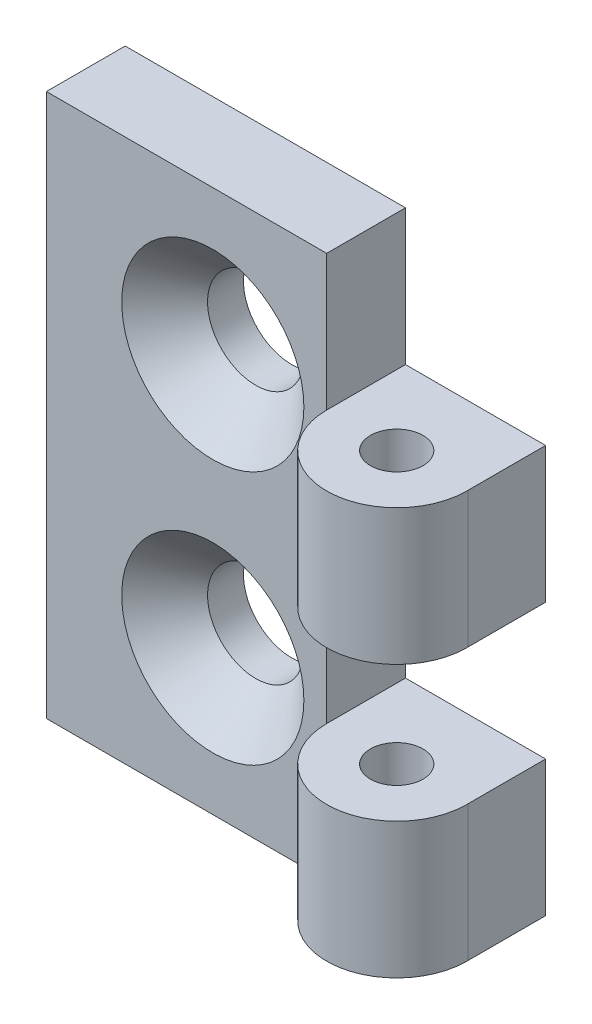
ISO-10303-21;
HEADER;
FILE_DESCRIPTION(('STEP AP214'),'2;1');
FILE_NAME('part.step','',(''),(''),'','','');
FILE_SCHEMA(('AUTOMOTIVE_DESIGN { 1 0 10303 214 1 1 1 1 }'));
ENDSEC;
DATA;
#1=APPLICATION_CONTEXT('core data for automotive mechanical design processes');
#2=APPLICATION_PROTOCOL_DEFINITION('international standard','automotive_design',2000,#1);
#3=PRODUCT_CONTEXT('',#1,'mechanical');
#4=PRODUCT('Part','Part','',(#3));
#5=PRODUCT_RELATED_PRODUCT_CATEGORY('part','',(#4));
#6=PRODUCT_DEFINITION_FORMATION('','',#4);
#7=PRODUCT_DEFINITION_CONTEXT('part definition',#1,'design');
#8=PRODUCT_DEFINITION('design','',#6,#7);
#9=PRODUCT_DEFINITION_SHAPE('','',#8);
#10=(LENGTH_UNIT() NAMED_UNIT(*) SI_UNIT(.MILLI.,.METRE.));
#11=(NAMED_UNIT(*) PLANE_ANGLE_UNIT() SI_UNIT($,.RADIAN.));
#12=(NAMED_UNIT(*) SI_UNIT($,.STERADIAN.) SOLID_ANGLE_UNIT());
#13=UNCERTAINTY_MEASURE_WITH_UNIT(LENGTH_MEASURE(1.E-05),#10,'distance_accuracy_value','');
#14=(GEOMETRIC_REPRESENTATION_CONTEXT(3) GLOBAL_UNCERTAINTY_ASSIGNED_CONTEXT((#13)) GLOBAL_UNIT_ASSIGNED_CONTEXT((#10,
#11,#12)) REPRESENTATION_CONTEXT('',''));
#15=CARTESIAN_POINT('',(0.,0.,0.));
#16=DIRECTION('',(0.,0.,1.));
#17=DIRECTION('',(1.,0.,0.));
#18=AXIS2_PLACEMENT_3D('',#15,#16,#17);
#19=CARTESIAN_POINT('',(0.,31.,4.5));
#20=DIRECTION('',(0.,-1.,0.));
#21=DIRECTION('',(1.,0.,0.));
#22=AXIS2_PLACEMENT_3D('',#19,#20,#21);
#23=PLANE('',#22);
#24=DIRECTION('',(-1.,0.,0.));
#25=VECTOR('',#24,1.);
#26=CARTESIAN_POINT('',(0.,31.,4.5));
#27=LINE('',#26,#25);
#28=CARTESIAN_POINT('',(-1.00000000000001,31.,4.5));
#29=VERTEX_POINT('',#28);
#30=CARTESIAN_POINT('',(-17.,31.,4.5));
#31=VERTEX_POINT('',#30);
#32=EDGE_CURVE('E255',#29,#31,#27,.T.);
#33=ORIENTED_EDGE('',*,*,#32,.F.);
#34=DIRECTION('',(0.,0.,1.));
#35=VECTOR('',#34,1.);
#36=CARTESIAN_POINT('',(-1.00000000000001,31.,-2.49999999998515E-05));
#37=LINE('',#36,#35);
#38=CARTESIAN_POINT('',(-1.00000000000001,31.,0.));
#39=VERTEX_POINT('',#38);
#40=EDGE_CURVE('E336',#39,#29,#37,.T.);
#41=ORIENTED_EDGE('',*,*,#40,.F.);
#42=DIRECTION('',(-1.,0.,0.));
#43=VECTOR('',#42,1.);
#44=CARTESIAN_POINT('',(0.,31.,0.));
#45=LINE('',#44,#43);
#46=CARTESIAN_POINT('',(-17.,31.,0.));
#47=VERTEX_POINT('',#46);
#48=EDGE_CURVE('E256',#39,#47,#45,.T.);
#49=ORIENTED_EDGE('',*,*,#48,.T.);
#50=DIRECTION('',(0.,0.,-1.));
#51=VECTOR('',#50,1.);
#52=CARTESIAN_POINT('',(-17.,31.,4.5));
#53=LINE('',#52,#51);
#54=EDGE_CURVE('E270',#31,#47,#53,.T.);
#55=ORIENTED_EDGE('',*,*,#54,.F.);
#56=EDGE_LOOP('',(#33,#41,#49,#55));
#57=FACE_BOUND('',#56,.T.);
#58=ADVANCED_FACE('F39',(#57),#23,.F.);
#59=CARTESIAN_POINT('',(-17.,0.,4.5));
#60=DIRECTION('',(1.,0.,0.));
#61=DIRECTION('',(0.,0.,-1.));
#62=AXIS2_PLACEMENT_3D('',#59,#60,#61);
#63=PLANE('',#62);
#64=DIRECTION('',(0.,-1.,0.));
#65=VECTOR('',#64,1.);
#66=CARTESIAN_POINT('',(-17.,0.,0.));
#67=LINE('',#66,#65);
#68=CARTESIAN_POINT('',(-17.,0.,0.));
#69=VERTEX_POINT('',#68);
#70=EDGE_CURVE('E265',#47,#69,#67,.T.);
#71=ORIENTED_EDGE('',*,*,#70,.T.);
#72=DIRECTION('',(0.,0.,-1.));
#73=VECTOR('',#72,1.);
#74=CARTESIAN_POINT('',(-17.,0.,4.5));
#75=LINE('',#74,#73);
#76=CARTESIAN_POINT('',(-17.,0.,4.5));
#77=VERTEX_POINT('',#76);
#78=EDGE_CURVE('E260',#77,#69,#75,.T.);
#79=ORIENTED_EDGE('',*,*,#78,.F.);
#80=DIRECTION('',(0.,-1.,0.));
#81=VECTOR('',#80,1.);
#82=CARTESIAN_POINT('',(-17.,0.,4.5));
#83=LINE('',#82,#81);
#84=EDGE_CURVE('E251',#31,#77,#83,.T.);
#85=ORIENTED_EDGE('',*,*,#84,.F.);
#86=ORIENTED_EDGE('',*,*,#54,.T.);
#87=EDGE_LOOP('',(#71,#79,#85,#86));
#88=FACE_BOUND('',#87,.T.);
#89=ADVANCED_FACE('F329',(#88),#63,.F.);
#90=CARTESIAN_POINT('',(0.,0.,4.5));
#91=DIRECTION('',(0.,1.,0.));
#92=DIRECTION('',(-1.,0.,0.));
#93=AXIS2_PLACEMENT_3D('',#90,#91,#92);
#94=PLANE('',#93);
#95=DIRECTION('',(1.,0.,0.));
#96=VECTOR('',#95,1.);
#97=CARTESIAN_POINT('',(0.,0.,0.));
#98=LINE('',#97,#96);
#99=CARTESIAN_POINT('',(6.99925102446683,0.,0.));
#100=VERTEX_POINT('',#99);
#101=EDGE_CURVE('E253',#69,#100,#98,.T.);
#102=ORIENTED_EDGE('',*,*,#101,.T.);
#103=DIRECTION('',(0.,0.,1.));
#104=VECTOR('',#103,1.);
#105=CARTESIAN_POINT('',(6.99925102446683,0.,0.));
#106=LINE('',#105,#104);
#107=CARTESIAN_POINT('',(6.99925102446683,0.,4.42259687796331));
#108=VERTEX_POINT('',#107);
#109=EDGE_CURVE('E169',#100,#108,#106,.T.);
#110=ORIENTED_EDGE('',*,*,#109,.T.);
#111=CARTESIAN_POINT('',(3.,0.,4.5));
#112=DIRECTION('',(0.,1.,0.));
#113=DIRECTION('',(0.999812756116708,0.,0.0193507805091532));
#114=AXIS2_PLACEMENT_3D('',#111,#112,#113);
#115=CIRCLE('',#114,4.);
#116=CARTESIAN_POINT('',(6.99925102446683,0.,4.57740312203661));
#117=VERTEX_POINT('',#116);
#118=EDGE_CURVE('E163',#117,#108,#115,.T.);
#119=ORIENTED_EDGE('',*,*,#118,.F.);
#120=CARTESIAN_POINT('',(3.,0.,4.5));
#121=DIRECTION('',(0.,1.,0.));
#122=DIRECTION('',(0.,0.,1.));
#123=AXIS2_PLACEMENT_3D('',#120,#121,#122);
#124=CIRCLE('',#123,4.);
#125=CARTESIAN_POINT('',(-1.,0.,4.5));
#126=VERTEX_POINT('',#125);
#127=EDGE_CURVE('E245',#126,#117,#124,.T.);
#128=ORIENTED_EDGE('',*,*,#127,.F.);
#129=DIRECTION('',(1.,0.,0.));
#130=VECTOR('',#129,1.);
#131=CARTESIAN_POINT('',(0.,0.,4.5));
#132=LINE('',#131,#130);
#133=EDGE_CURVE('E259',#77,#126,#132,.T.);
#134=ORIENTED_EDGE('',*,*,#133,.F.);
#135=ORIENTED_EDGE('',*,*,#78,.T.);
#136=EDGE_LOOP('',(#102,#110,#119,#128,#134,#135));
#137=FACE_BOUND('',#136,.T.);
#138=CARTESIAN_POINT('',(3.,0.,4.5));
#139=DIRECTION('',(0.,1.,0.));
#140=DIRECTION('',(0.,0.,1.));
#141=AXIS2_PLACEMENT_3D('',#138,#139,#140);
#142=CIRCLE('',#141,1.5);
#143=CARTESIAN_POINT('',(3.,0.,6.));
#144=VERTEX_POINT('',#143);
#145=EDGE_CURVE('E309',#144,#144,#142,.T.);
#146=ORIENTED_EDGE('',*,*,#145,.T.);
#147=EDGE_LOOP('',(#146));
#148=FACE_BOUND('',#147,.T.);
#149=ADVANCED_FACE('F314',(#137,#148),#94,.F.);
#150=CARTESIAN_POINT('',(0.,0.,4.5));
#151=DIRECTION('',(0.,0.,1.));
#152=DIRECTION('',(1.,0.,0.));
#153=AXIS2_PLACEMENT_3D('',#150,#151,#152);
#154=PLANE('',#153);
#155=DIRECTION('',(0.,-1.,0.));
#156=VECTOR('',#155,1.);
#157=CARTESIAN_POINT('',(-1.,15.5,4.5));
#158=LINE('',#157,#156);
#159=CARTESIAN_POINT('',(-1.,15.5,4.5));
#160=VERTEX_POINT('',#159);
#161=CARTESIAN_POINT('',(-1.,7.75,4.5));
#162=VERTEX_POINT('',#161);
#163=EDGE_CURVE('E133',#160,#162,#158,.T.);
#164=ORIENTED_EDGE('',*,*,#163,.F.);
#165=DIRECTION('',(0.,-1.,0.));
#166=VECTOR('',#165,1.);
#167=CARTESIAN_POINT('',(-1.,23.25,4.5));
#168=LINE('',#167,#166);
#169=CARTESIAN_POINT('',(-1.,23.25,4.5));
#170=VERTEX_POINT('',#169);
#171=EDGE_CURVE('E152',#160,#170,#168,.F.);
#172=ORIENTED_EDGE('',*,*,#171,.T.);
#173=DIRECTION('',(0.,-1.,0.));
#174=VECTOR('',#173,1.);
#175=CARTESIAN_POINT('',(-1.00000000000001,31.,4.5));
#176=LINE('',#175,#174);
#177=EDGE_CURVE('E151',#29,#170,#176,.T.);
#178=ORIENTED_EDGE('',*,*,#177,.F.);
#179=ORIENTED_EDGE('',*,*,#32,.T.);
#180=ORIENTED_EDGE('',*,*,#84,.T.);
#181=ORIENTED_EDGE('',*,*,#133,.T.);
#182=DIRECTION('',(0.,-1.,0.));
#183=VECTOR('',#182,1.);
#184=CARTESIAN_POINT('',(-1.,7.75,4.5));
#185=LINE('',#184,#183);
#186=EDGE_CURVE('E154',#126,#162,#185,.F.);
#187=ORIENTED_EDGE('',*,*,#186,.T.);
#188=EDGE_LOOP('',(#164,#172,#178,#179,#180,#181,#187));
#189=FACE_BOUND('',#188,.T.);
#190=CARTESIAN_POINT('',(-7.5,8.25,4.5));
#191=DIRECTION('',(0.,0.,1.));
#192=DIRECTION('',(1.,0.,0.));
#193=AXIS2_PLACEMENT_3D('',#190,#191,#192);
#194=CIRCLE('',#193,5.2);
#195=CARTESIAN_POINT('',(-2.3,8.25,4.5));
#196=VERTEX_POINT('',#195);
#197=EDGE_CURVE('E286',#196,#196,#194,.T.);
#198=ORIENTED_EDGE('',*,*,#197,.F.);
#199=EDGE_LOOP('',(#198));
#200=FACE_BOUND('',#199,.T.);
#201=CARTESIAN_POINT('',(-7.5,22.75,4.5));
#202=DIRECTION('',(0.,0.,1.));
#203=DIRECTION('',(1.,0.,0.));
#204=AXIS2_PLACEMENT_3D('',#201,#202,#203);
#205=CIRCLE('',#204,5.2);
#206=CARTESIAN_POINT('',(-2.3,22.75,4.5));
#207=VERTEX_POINT('',#206);
#208=EDGE_CURVE('E301',#207,#207,#205,.T.);
#209=ORIENTED_EDGE('',*,*,#208,.F.);
#210=EDGE_LOOP('',(#209));
#211=FACE_BOUND('',#210,.T.);
#212=ADVANCED_FACE('F147',(#189,#200,#211),#154,.T.);
#213=CARTESIAN_POINT('',(0.,0.,0.));
#214=DIRECTION('',(0.,0.,1.));
#215=DIRECTION('',(1.,0.,0.));
#216=AXIS2_PLACEMENT_3D('',#213,#214,#215);
#217=PLANE('',#216);
#218=CARTESIAN_POINT('',(-7.5,8.25,0.));
#219=DIRECTION('',(0.,0.,1.));
#220=DIRECTION('',(1.,0.,0.));
#221=AXIS2_PLACEMENT_3D('',#218,#219,#220);
#222=CIRCLE('',#221,2.75);
#223=CARTESIAN_POINT('',(-4.75,8.25,0.));
#224=VERTEX_POINT('',#223);
#225=EDGE_CURVE('E291',#224,#224,#222,.T.);
#226=ORIENTED_EDGE('',*,*,#225,.T.);
#227=EDGE_LOOP('',(#226));
#228=FACE_BOUND('',#227,.T.);
#229=CARTESIAN_POINT('',(-7.5,22.75,0.));
#230=DIRECTION('',(0.,0.,1.));
#231=DIRECTION('',(1.,0.,0.));
#232=AXIS2_PLACEMENT_3D('',#229,#230,#231);
#233=CIRCLE('',#232,2.75);
#234=CARTESIAN_POINT('',(-4.75,22.75,0.));
#235=VERTEX_POINT('',#234);
#236=EDGE_CURVE('E310',#235,#235,#233,.T.);
#237=ORIENTED_EDGE('',*,*,#236,.T.);
#238=EDGE_LOOP('',(#237));
#239=FACE_BOUND('',#238,.T.);
#240=DIRECTION('',(0.,-1.,0.));
#241=VECTOR('',#240,1.);
#242=CARTESIAN_POINT('',(-1.,0.,0.));
#243=LINE('',#242,#241);
#244=CARTESIAN_POINT('',(-1.,15.5,0.));
#245=VERTEX_POINT('',#244);
#246=CARTESIAN_POINT('',(-1.,7.75,0.));
#247=VERTEX_POINT('',#246);
#248=EDGE_CURVE('E137',#245,#247,#243,.T.);
#249=ORIENTED_EDGE('',*,*,#248,.T.);
#250=DIRECTION('',(1.,0.,0.));
#251=VECTOR('',#250,1.);
#252=CARTESIAN_POINT('',(0.,7.75,0.));
#253=LINE('',#252,#251);
#254=CARTESIAN_POINT('',(6.99925102446683,7.75,0.));
#255=VERTEX_POINT('',#254);
#256=EDGE_CURVE('E190',#247,#255,#253,.T.);
#257=ORIENTED_EDGE('',*,*,#256,.T.);
#258=DIRECTION('',(0.,-1.,0.));
#259=VECTOR('',#258,1.);
#260=CARTESIAN_POINT('',(6.99925102446683,16.1131414100881,0.));
#261=LINE('',#260,#259);
#262=EDGE_CURVE('E188',#255,#100,#261,.T.);
#263=ORIENTED_EDGE('',*,*,#262,.T.);
#264=ORIENTED_EDGE('',*,*,#101,.F.);
#265=ORIENTED_EDGE('',*,*,#70,.F.);
#266=ORIENTED_EDGE('',*,*,#48,.F.);
#267=DIRECTION('',(0.,-1.,0.));
#268=VECTOR('',#267,1.);
#269=CARTESIAN_POINT('',(-1.,0.,0.));
#270=LINE('',#269,#268);
#271=CARTESIAN_POINT('',(-1.,23.25,0.));
#272=VERTEX_POINT('',#271);
#273=EDGE_CURVE('E348',#39,#272,#270,.T.);
#274=ORIENTED_EDGE('',*,*,#273,.T.);
#275=DIRECTION('',(1.,0.,0.));
#276=VECTOR('',#275,1.);
#277=CARTESIAN_POINT('',(0.,23.25,0.));
#278=LINE('',#277,#276);
#279=CARTESIAN_POINT('',(6.99925102446683,23.25,0.));
#280=VERTEX_POINT('',#279);
#281=EDGE_CURVE('E357',#272,#280,#278,.T.);
#282=ORIENTED_EDGE('',*,*,#281,.T.);
#283=DIRECTION('',(0.,-1.,0.));
#284=VECTOR('',#283,1.);
#285=CARTESIAN_POINT('',(6.99925102446683,31.6131414100881,0.));
#286=LINE('',#285,#284);
#287=CARTESIAN_POINT('',(6.99925102446683,15.5,0.));
#288=VERTEX_POINT('',#287);
#289=EDGE_CURVE('E359',#280,#288,#286,.T.);
#290=ORIENTED_EDGE('',*,*,#289,.T.);
#291=DIRECTION('',(1.,0.,0.));
#292=VECTOR('',#291,1.);
#293=CARTESIAN_POINT('',(0.,15.5,0.));
#294=LINE('',#293,#292);
#295=EDGE_CURVE('E353',#245,#288,#294,.T.);
#296=ORIENTED_EDGE('',*,*,#295,.F.);
#297=EDGE_LOOP('',(#249,#257,#263,#264,#265,#266,#274,#282,#290,#296));
#298=FACE_BOUND('',#297,.T.);
#299=ADVANCED_FACE('F428',(#228,#239,#298),#217,.F.);
#300=CARTESIAN_POINT('',(3.,7.75,4.5));
#301=DIRECTION('',(0.,1.,0.));
#302=DIRECTION('',(0.,0.,1.));
#303=AXIS2_PLACEMENT_3D('',#300,#301,#302);
#304=PLANE('',#303);
#305=ORIENTED_EDGE('',*,*,#256,.F.);
#306=DIRECTION('',(0.,0.,1.));
#307=VECTOR('',#306,1.);
#308=CARTESIAN_POINT('',(-1.,7.75,-2.49999999998515E-05));
#309=LINE('',#308,#307);
#310=EDGE_CURVE('E145',#247,#162,#309,.T.);
#311=ORIENTED_EDGE('',*,*,#310,.T.);
#312=CARTESIAN_POINT('',(3.,7.75,4.5));
#313=DIRECTION('',(0.,1.,0.));
#314=DIRECTION('',(0.,0.,1.));
#315=AXIS2_PLACEMENT_3D('',#312,#313,#314);
#316=CIRCLE('',#315,4.);
#317=CARTESIAN_POINT('',(6.99925102446683,7.75,4.57740312203661));
#318=VERTEX_POINT('',#317);
#319=EDGE_CURVE('E202',#162,#318,#316,.T.);
#320=ORIENTED_EDGE('',*,*,#319,.T.);
#321=CARTESIAN_POINT('',(6.99925102446683,7.75,4.57740312203661));
#322=DIRECTION('',(0.,0.,-1.));
#323=VECTOR('',#322,1.);
#324=LINE('',#321,#323);
#325=CARTESIAN_POINT('',(6.99925102446683,7.75,4.42259687796331));
#326=VERTEX_POINT('',#325);
#327=EDGE_CURVE('E205',#318,#326,#324,.T.);
#328=ORIENTED_EDGE('',*,*,#327,.T.);
#329=DIRECTION('',(0.,0.,1.));
#330=VECTOR('',#329,1.);
#331=CARTESIAN_POINT('',(6.99925102446683,7.75,0.));
#332=LINE('',#331,#330);
#333=EDGE_CURVE('E192',#255,#326,#332,.T.);
#334=ORIENTED_EDGE('',*,*,#333,.F.);
#335=EDGE_LOOP('',(#305,#311,#320,#328,#334));
#336=FACE_BOUND('',#335,.T.);
#337=CARTESIAN_POINT('',(3.,7.75,4.5));
#338=DIRECTION('',(0.,1.,0.));
#339=DIRECTION('',(0.,0.,1.));
#340=AXIS2_PLACEMENT_3D('',#337,#338,#339);
#341=CIRCLE('',#340,1.5);
#342=CARTESIAN_POINT('',(3.,7.75,6.));
#343=VERTEX_POINT('',#342);
#344=EDGE_CURVE('E242',#343,#343,#341,.T.);
#345=ORIENTED_EDGE('',*,*,#344,.F.);
#346=EDGE_LOOP('',(#345));
#347=FACE_BOUND('',#346,.T.);
#348=ADVANCED_FACE('F224',(#336,#347),#304,.T.);
#349=CARTESIAN_POINT('',(3.,7.75,4.5));
#350=DIRECTION('',(0.,-1.,0.));
#351=DIRECTION('',(0.,0.,-1.));
#352=AXIS2_PLACEMENT_3D('',#349,#350,#351);
#353=CYLINDRICAL_SURFACE('',#352,4.);
#354=ORIENTED_EDGE('',*,*,#127,.T.);
#355=ORIENTED_EDGE('',*,*,#118,.T.);
#356=DIRECTION('',(0.,-1.,0.));
#357=VECTOR('',#356,1.);
#358=CARTESIAN_POINT('',(6.99925102446683,7.75,4.42259687796331));
#359=LINE('',#358,#357);
#360=EDGE_CURVE('E199',#108,#326,#359,.F.);
#361=ORIENTED_EDGE('',*,*,#360,.T.);
#362=ORIENTED_EDGE('',*,*,#327,.F.);
#363=ORIENTED_EDGE('',*,*,#319,.F.);
#364=ORIENTED_EDGE('',*,*,#186,.F.);
#365=EDGE_LOOP('',(#354,#355,#361,#362,#363,#364));
#366=FACE_BOUND('',#365,.T.);
#367=ADVANCED_FACE('F215',(#366),#353,.T.);
#368=CARTESIAN_POINT('',(3.,7.75,4.5));
#369=DIRECTION('',(0.,-1.,0.));
#370=DIRECTION('',(0.,0.,-1.));
#371=AXIS2_PLACEMENT_3D('',#368,#369,#370);
#372=CYLINDRICAL_SURFACE('',#371,1.5);
#373=ORIENTED_EDGE('',*,*,#344,.T.);
#374=EDGE_LOOP('',(#373));
#375=FACE_BOUND('',#374,.T.);
#376=ORIENTED_EDGE('',*,*,#145,.F.);
#377=EDGE_LOOP('',(#376));
#378=FACE_BOUND('',#377,.T.);
#379=ADVANCED_FACE('F223',(#375,#378),#372,.F.);
#380=CARTESIAN_POINT('',(-7.5,22.75,4.5));
#381=DIRECTION('',(0.,0.,1.));
#382=DIRECTION('',(1.,0.,0.));
#383=AXIS2_PLACEMENT_3D('',#380,#381,#382);
#384=CYLINDRICAL_SURFACE('',#383,2.75);
#385=ORIENTED_EDGE('',*,*,#236,.F.);
#386=EDGE_LOOP('',(#385));
#387=FACE_BOUND('',#386,.T.);
#388=CARTESIAN_POINT('',(-7.5,22.75,2.05));
#389=DIRECTION('',(0.,0.,1.));
#390=DIRECTION('',(1.,0.,0.));
#391=AXIS2_PLACEMENT_3D('',#388,#389,#390);
#392=CIRCLE('',#391,2.75);
#393=CARTESIAN_POINT('',(-4.75,22.75,2.05));
#394=VERTEX_POINT('',#393);
#395=EDGE_CURVE('E302',#394,#394,#392,.T.);
#396=ORIENTED_EDGE('',*,*,#395,.T.);
#397=EDGE_LOOP('',(#396));
#398=FACE_BOUND('',#397,.T.);
#399=ADVANCED_FACE('F319',(#387,#398),#384,.F.);
#400=CARTESIAN_POINT('',(-7.5,22.75,4.5));
#401=DIRECTION('',(0.,0.,1.));
#402=DIRECTION('',(1.,0.,0.));
#403=AXIS2_PLACEMENT_3D('',#400,#401,#402);
#404=CONICAL_SURFACE('',#403,5.2,0.785398163397448);
#405=ORIENTED_EDGE('',*,*,#395,.F.);
#406=EDGE_LOOP('',(#405));
#407=FACE_BOUND('',#406,.T.);
#408=ORIENTED_EDGE('',*,*,#208,.T.);
#409=EDGE_LOOP('',(#408));
#410=FACE_BOUND('',#409,.T.);
#411=ADVANCED_FACE('F325',(#407,#410),#404,.F.);
#412=CARTESIAN_POINT('',(-7.5,8.25,4.5));
#413=DIRECTION('',(0.,0.,1.));
#414=DIRECTION('',(1.,0.,0.));
#415=AXIS2_PLACEMENT_3D('',#412,#413,#414);
#416=CYLINDRICAL_SURFACE('',#415,2.75);
#417=ORIENTED_EDGE('',*,*,#225,.F.);
#418=EDGE_LOOP('',(#417));
#419=FACE_BOUND('',#418,.T.);
#420=CARTESIAN_POINT('',(-7.5,8.25,2.05));
#421=DIRECTION('',(0.,0.,1.));
#422=DIRECTION('',(1.,0.,0.));
#423=AXIS2_PLACEMENT_3D('',#420,#421,#422);
#424=CIRCLE('',#423,2.75);
#425=CARTESIAN_POINT('',(-4.75,8.25,2.05));
#426=VERTEX_POINT('',#425);
#427=EDGE_CURVE('E287',#426,#426,#424,.T.);
#428=ORIENTED_EDGE('',*,*,#427,.T.);
#429=EDGE_LOOP('',(#428));
#430=FACE_BOUND('',#429,.T.);
#431=ADVANCED_FACE('F414',(#419,#430),#416,.F.);
#432=CARTESIAN_POINT('',(-7.5,8.25,4.5));
#433=DIRECTION('',(0.,0.,1.));
#434=DIRECTION('',(1.,0.,0.));
#435=AXIS2_PLACEMENT_3D('',#432,#433,#434);
#436=CONICAL_SURFACE('',#435,5.2,0.785398163397448);
#437=ORIENTED_EDGE('',*,*,#427,.F.);
#438=EDGE_LOOP('',(#437));
#439=FACE_BOUND('',#438,.T.);
#440=ORIENTED_EDGE('',*,*,#197,.T.);
#441=EDGE_LOOP('',(#440));
#442=FACE_BOUND('',#441,.T.);
#443=ADVANCED_FACE('F406',(#439,#442),#436,.F.);
#444=CARTESIAN_POINT('',(6.99925102446683,16.1131414100881,0.));
#445=DIRECTION('',(1.,0.,0.));
#446=DIRECTION('',(0.,1.,0.));
#447=AXIS2_PLACEMENT_3D('',#444,#445,#446);
#448=PLANE('',#447);
#449=ORIENTED_EDGE('',*,*,#360,.F.);
#450=ORIENTED_EDGE('',*,*,#109,.F.);
#451=ORIENTED_EDGE('',*,*,#262,.F.);
#452=ORIENTED_EDGE('',*,*,#333,.T.);
#453=EDGE_LOOP('',(#449,#450,#451,#452));
#454=FACE_BOUND('',#453,.T.);
#455=ADVANCED_FACE('F283',(#454),#448,.T.);
#456=CARTESIAN_POINT('',(3.,23.25,4.5));
#457=DIRECTION('',(0.,1.,0.));
#458=DIRECTION('',(0.,0.,1.));
#459=AXIS2_PLACEMENT_3D('',#456,#457,#458);
#460=PLANE('',#459);
#461=ORIENTED_EDGE('',*,*,#281,.F.);
#462=DIRECTION('',(0.,0.,1.));
#463=VECTOR('',#462,1.);
#464=CARTESIAN_POINT('',(-1.,23.25,-2.49999999998515E-05));
#465=LINE('',#464,#463);
#466=EDGE_CURVE('E347',#272,#170,#465,.T.);
#467=ORIENTED_EDGE('',*,*,#466,.T.);
#468=CARTESIAN_POINT('',(3.,23.25,4.5));
#469=DIRECTION('',(0.,1.,0.));
#470=DIRECTION('',(0.,0.,1.));
#471=AXIS2_PLACEMENT_3D('',#468,#469,#470);
#472=CIRCLE('',#471,4.);
#473=CARTESIAN_POINT('',(6.99925102446683,23.25,4.57740312203661));
#474=VERTEX_POINT('',#473);
#475=EDGE_CURVE('E158',#170,#474,#472,.T.);
#476=ORIENTED_EDGE('',*,*,#475,.T.);
#477=CARTESIAN_POINT('',(6.99925102446683,23.25,4.57740312203661));
#478=DIRECTION('',(0.,0.,-1.));
#479=VECTOR('',#478,1.);
#480=LINE('',#477,#479);
#481=CARTESIAN_POINT('',(6.99925102446683,23.25,4.42259687796322));
#482=VERTEX_POINT('',#481);
#483=EDGE_CURVE('E11',#474,#482,#480,.T.);
#484=ORIENTED_EDGE('',*,*,#483,.T.);
#485=DIRECTION('',(0.,0.,1.));
#486=VECTOR('',#485,1.);
#487=CARTESIAN_POINT('',(6.99925102446683,23.25,0.));
#488=LINE('',#487,#486);
#489=EDGE_CURVE('E363',#280,#482,#488,.T.);
#490=ORIENTED_EDGE('',*,*,#489,.F.);
#491=EDGE_LOOP('',(#461,#467,#476,#484,#490));
#492=FACE_BOUND('',#491,.T.);
#493=CARTESIAN_POINT('',(3.,23.25,4.5));
#494=DIRECTION('',(0.,1.,0.));
#495=DIRECTION('',(0.,0.,1.));
#496=AXIS2_PLACEMENT_3D('',#493,#494,#495);
#497=CIRCLE('',#496,1.5);
#498=CARTESIAN_POINT('',(3.,23.25,6.));
#499=VERTEX_POINT('',#498);
#500=EDGE_CURVE('E170',#499,#499,#497,.T.);
#501=ORIENTED_EDGE('',*,*,#500,.F.);
#502=EDGE_LOOP('',(#501));
#503=FACE_BOUND('',#502,.T.);
#504=ADVANCED_FACE('F388',(#492,#503),#460,.T.);
#505=CARTESIAN_POINT('',(3.,15.5,4.5));
#506=DIRECTION('',(0.,1.,0.));
#507=DIRECTION('',(0.,0.,1.));
#508=AXIS2_PLACEMENT_3D('',#505,#506,#507);
#509=PLANE('',#508);
#510=DIRECTION('',(0.,0.,1.));
#511=VECTOR('',#510,1.);
#512=CARTESIAN_POINT('',(-1.,15.5,-2.49999999998515E-05));
#513=LINE('',#512,#511);
#514=EDGE_CURVE('E132',#245,#160,#513,.T.);
#515=ORIENTED_EDGE('',*,*,#514,.F.);
#516=ORIENTED_EDGE('',*,*,#295,.T.);
#517=DIRECTION('',(0.,0.,1.));
#518=VECTOR('',#517,1.);
#519=CARTESIAN_POINT('',(6.99925102446683,15.5,0.));
#520=LINE('',#519,#518);
#521=CARTESIAN_POINT('',(6.99925102446683,15.5,4.42259687796322));
#522=VERTEX_POINT('',#521);
#523=EDGE_CURVE('E358',#288,#522,#520,.T.);
#524=ORIENTED_EDGE('',*,*,#523,.T.);
#525=CARTESIAN_POINT('',(3.,15.5,4.5));
#526=DIRECTION('',(0.,1.,0.));
#527=DIRECTION('',(0.999812756116708,0.,0.0193507805091536));
#528=AXIS2_PLACEMENT_3D('',#525,#526,#527);
#529=CIRCLE('',#528,4.);
#530=CARTESIAN_POINT('',(6.99925102446683,15.5,4.57740312203661));
#531=VERTEX_POINT('',#530);
#532=EDGE_CURVE('E47',#531,#522,#529,.T.);
#533=ORIENTED_EDGE('',*,*,#532,.F.);
#534=CARTESIAN_POINT('',(3.,15.5,4.5));
#535=DIRECTION('',(0.,1.,0.));
#536=DIRECTION('',(0.,0.,1.));
#537=AXIS2_PLACEMENT_3D('',#534,#535,#536);
#538=CIRCLE('',#537,4.);
#539=EDGE_CURVE('E157',#160,#531,#538,.T.);
#540=ORIENTED_EDGE('',*,*,#539,.F.);
#541=EDGE_LOOP('',(#515,#516,#524,#533,#540));
#542=FACE_BOUND('',#541,.T.);
#543=CARTESIAN_POINT('',(3.,15.5,4.5));
#544=DIRECTION('',(0.,1.,0.));
#545=DIRECTION('',(0.,0.,1.));
#546=AXIS2_PLACEMENT_3D('',#543,#544,#545);
#547=CIRCLE('',#546,1.5);
#548=CARTESIAN_POINT('',(3.,15.5,6.));
#549=VERTEX_POINT('',#548);
#550=EDGE_CURVE('E175',#549,#549,#547,.T.);
#551=ORIENTED_EDGE('',*,*,#550,.T.);
#552=EDGE_LOOP('',(#551));
#553=FACE_BOUND('',#552,.T.);
#554=ADVANCED_FACE('F161',(#542,#553),#509,.F.);
#555=CARTESIAN_POINT('',(3.,23.25,4.5));
#556=DIRECTION('',(0.,-1.,0.));
#557=DIRECTION('',(0.,0.,-1.));
#558=AXIS2_PLACEMENT_3D('',#555,#556,#557);
#559=CYLINDRICAL_SURFACE('',#558,4.);
#560=ORIENTED_EDGE('',*,*,#539,.T.);
#561=ORIENTED_EDGE('',*,*,#532,.T.);
#562=DIRECTION('',(0.,-1.,0.));
#563=VECTOR('',#562,1.);
#564=CARTESIAN_POINT('',(6.99925102446683,23.25,4.42259687796322));
#565=LINE('',#564,#563);
#566=EDGE_CURVE('E159',#522,#482,#565,.F.);
#567=ORIENTED_EDGE('',*,*,#566,.T.);
#568=ORIENTED_EDGE('',*,*,#483,.F.);
#569=ORIENTED_EDGE('',*,*,#475,.F.);
#570=ORIENTED_EDGE('',*,*,#171,.F.);
#571=EDGE_LOOP('',(#560,#561,#567,#568,#569,#570));
#572=FACE_BOUND('',#571,.T.);
#573=ADVANCED_FACE('F160',(#572),#559,.T.);
#574=CARTESIAN_POINT('',(3.,23.25,4.5));
#575=DIRECTION('',(0.,-1.,0.));
#576=DIRECTION('',(0.,0.,-1.));
#577=AXIS2_PLACEMENT_3D('',#574,#575,#576);
#578=CYLINDRICAL_SURFACE('',#577,1.5);
#579=ORIENTED_EDGE('',*,*,#500,.T.);
#580=EDGE_LOOP('',(#579));
#581=FACE_BOUND('',#580,.T.);
#582=ORIENTED_EDGE('',*,*,#550,.F.);
#583=EDGE_LOOP('',(#582));
#584=FACE_BOUND('',#583,.T.);
#585=ADVANCED_FACE('F373',(#581,#584),#578,.F.);
#586=CARTESIAN_POINT('',(6.99925102446683,31.6131414100881,0.));
#587=DIRECTION('',(1.,0.,0.));
#588=DIRECTION('',(0.,1.,0.));
#589=AXIS2_PLACEMENT_3D('',#586,#587,#588);
#590=PLANE('',#589);
#591=ORIENTED_EDGE('',*,*,#566,.F.);
#592=ORIENTED_EDGE('',*,*,#523,.F.);
#593=ORIENTED_EDGE('',*,*,#289,.F.);
#594=ORIENTED_EDGE('',*,*,#489,.T.);
#595=EDGE_LOOP('',(#591,#592,#593,#594));
#596=FACE_BOUND('',#595,.T.);
#597=ADVANCED_FACE('F374',(#596),#590,.T.);
#598=CARTESIAN_POINT('',(-1.,15.5,-2.49999999998515E-05));
#599=DIRECTION('',(-1.,0.,0.));
#600=DIRECTION('',(0.,0.,1.));
#601=AXIS2_PLACEMENT_3D('',#598,#599,#600);
#602=PLANE('',#601);
#603=ORIENTED_EDGE('',*,*,#514,.T.);
#604=ORIENTED_EDGE('',*,*,#163,.T.);
#605=ORIENTED_EDGE('',*,*,#310,.F.);
#606=ORIENTED_EDGE('',*,*,#248,.F.);
#607=EDGE_LOOP('',(#603,#604,#605,#606));
#608=FACE_BOUND('',#607,.T.);
#609=ADVANCED_FACE('F134',(#608),#602,.F.);
#610=CARTESIAN_POINT('',(-1.00000000000001,31.,-2.49999999998515E-05));
#611=DIRECTION('',(-1.,0.,0.));
#612=DIRECTION('',(0.,-1.,0.));
#613=AXIS2_PLACEMENT_3D('',#610,#611,#612);
#614=PLANE('',#613);
#615=ORIENTED_EDGE('',*,*,#40,.T.);
#616=ORIENTED_EDGE('',*,*,#177,.T.);
#617=ORIENTED_EDGE('',*,*,#466,.F.);
#618=ORIENTED_EDGE('',*,*,#273,.F.);
#619=EDGE_LOOP('',(#615,#616,#617,#618));
#620=FACE_BOUND('',#619,.T.);
#621=ADVANCED_FACE('F447',(#620),#614,.F.);
#622=CLOSED_SHELL('',(#58,#89,#149,#212,#299,#348,#367,#379,#399,#411,#431,#443,#455,#504,#554,
#573,#585,#597,#609,#621));
#623=MANIFOLD_SOLID_BREP('B2',#622);
#624=ADVANCED_BREP_SHAPE_REPRESENTATION('',(#18,#623),#14);
#625=SHAPE_DEFINITION_REPRESENTATION(#9,#624);
ENDSEC;
END-ISO-10303-21;
